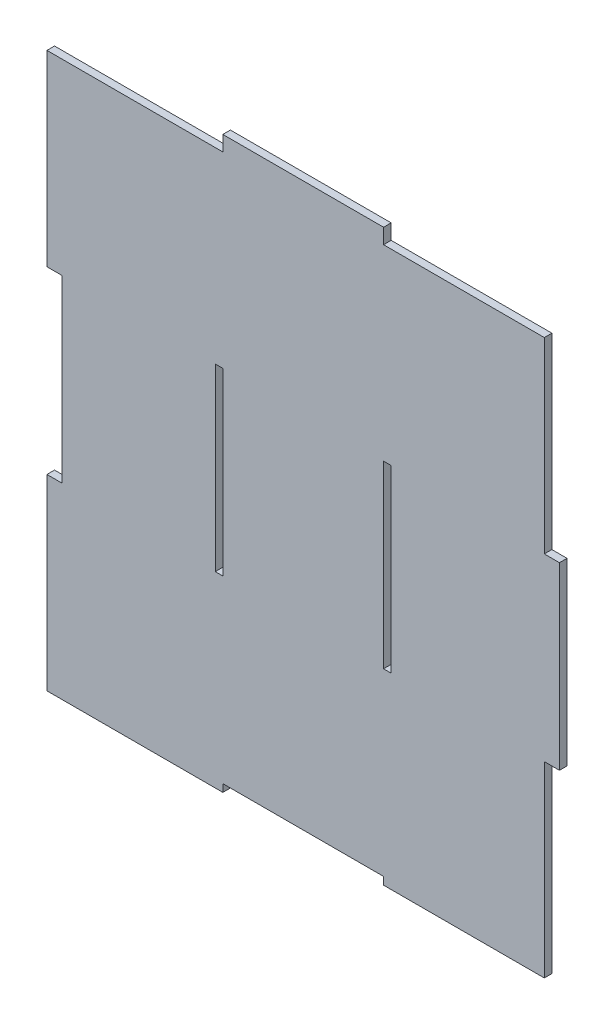
ISO-10303-21;
HEADER;
FILE_DESCRIPTION(('STEP AP214'),'2;1');
FILE_NAME('part.step','',(''),(''),'','','');
FILE_SCHEMA(('AUTOMOTIVE_DESIGN { 1 0 10303 214 1 1 1 1 }'));
ENDSEC;
DATA;
#1=APPLICATION_CONTEXT('core data for automotive mechanical design processes');
#2=APPLICATION_PROTOCOL_DEFINITION('international standard','automotive_design',2000,#1);
#3=PRODUCT_CONTEXT('',#1,'mechanical');
#4=PRODUCT('Part','Part','',(#3));
#5=PRODUCT_RELATED_PRODUCT_CATEGORY('part','',(#4));
#6=PRODUCT_DEFINITION_FORMATION('','',#4);
#7=PRODUCT_DEFINITION_CONTEXT('part definition',#1,'design');
#8=PRODUCT_DEFINITION('design','',#6,#7);
#9=PRODUCT_DEFINITION_SHAPE('','',#8);
#10=(LENGTH_UNIT() NAMED_UNIT(*) SI_UNIT(.MILLI.,.METRE.));
#11=(NAMED_UNIT(*) PLANE_ANGLE_UNIT() SI_UNIT($,.RADIAN.));
#12=(NAMED_UNIT(*) SI_UNIT($,.STERADIAN.) SOLID_ANGLE_UNIT());
#13=UNCERTAINTY_MEASURE_WITH_UNIT(LENGTH_MEASURE(1.E-05),#10,'distance_accuracy_value','');
#14=(GEOMETRIC_REPRESENTATION_CONTEXT(3) GLOBAL_UNCERTAINTY_ASSIGNED_CONTEXT((#13)) GLOBAL_UNIT_ASSIGNED_CONTEXT((#10,
#11,#12)) REPRESENTATION_CONTEXT('',''));
#15=CARTESIAN_POINT('',(0.,0.,0.));
#16=DIRECTION('',(0.,0.,1.));
#17=DIRECTION('',(1.,0.,0.));
#18=AXIS2_PLACEMENT_3D('',#15,#16,#17);
#19=CARTESIAN_POINT('',(0.,0.,0.));
#20=DIRECTION('',(0.,0.,1.));
#21=DIRECTION('',(1.,0.,0.));
#22=AXIS2_PLACEMENT_3D('',#19,#20,#21);
#23=PLANE('',#22);
#24=DIRECTION('',(1.,0.,0.));
#25=VECTOR('',#24,1.);
#26=CARTESIAN_POINT('',(-1.64639372418169E-13,-37.6666666666669,0.));
#27=LINE('',#26,#25);
#28=CARTESIAN_POINT('',(-48.8416666666666,-37.6666666666667,0.));
#29=VERTEX_POINT('',#28);
#30=CARTESIAN_POINT('',(-45.6666666666667,-37.6666666666667,0.));
#31=VERTEX_POINT('',#30);
#32=EDGE_CURVE('E446',#29,#31,#27,.T.);
#33=ORIENTED_EDGE('',*,*,#32,.T.);
#34=DIRECTION('',(0.,-1.,0.));
#35=VECTOR('',#34,1.);
#36=CARTESIAN_POINT('',(-45.6666666666667,0.,0.));
#37=LINE('',#36,#35);
#38=CARTESIAN_POINT('',(-45.6666666666667,37.6666666666667,0.));
#39=VERTEX_POINT('',#38);
#40=EDGE_CURVE('E349',#39,#31,#37,.T.);
#41=ORIENTED_EDGE('',*,*,#40,.F.);
#42=DIRECTION('',(1.,0.,0.));
#43=VECTOR('',#42,1.);
#44=CARTESIAN_POINT('',(-1.64639372418169E-13,37.6666666666669,0.));
#45=LINE('',#44,#43);
#46=CARTESIAN_POINT('',(-48.8416666666667,37.6666666666667,0.));
#47=VERTEX_POINT('',#46);
#48=EDGE_CURVE('E450',#47,#39,#45,.T.);
#49=ORIENTED_EDGE('',*,*,#48,.F.);
#50=DIRECTION('',(0.,1.,0.));
#51=VECTOR('',#50,1.);
#52=CARTESIAN_POINT('',(-48.8416666666667,0.,0.));
#53=LINE('',#52,#51);
#54=EDGE_CURVE('E283',#29,#47,#53,.T.);
#55=ORIENTED_EDGE('',*,*,#54,.F.);
#56=EDGE_LOOP('',(#33,#41,#49,#55));
#57=FACE_BOUND('',#56,.T.);
#58=DIRECTION('',(0.,1.,0.));
#59=VECTOR('',#58,1.);
#60=CARTESIAN_POINT('',(24.8416666666666,0.,0.));
#61=LINE('',#60,#59);
#62=CARTESIAN_POINT('',(24.8416666666666,-37.6666666666667,0.));
#63=VERTEX_POINT('',#62);
#64=CARTESIAN_POINT('',(24.8416666666666,37.6666666666667,0.));
#65=VERTEX_POINT('',#64);
#66=EDGE_CURVE('E434',#63,#65,#61,.T.);
#67=ORIENTED_EDGE('',*,*,#66,.T.);
#68=DIRECTION('',(-1.,0.,0.));
#69=VECTOR('',#68,1.);
#70=CARTESIAN_POINT('',(1.64639372418169E-13,37.6666666666668,0.));
#71=LINE('',#70,#69);
#72=CARTESIAN_POINT('',(21.6666666666667,37.6666666666667,0.));
#73=VERTEX_POINT('',#72);
#74=EDGE_CURVE('E443',#65,#73,#71,.T.);
#75=ORIENTED_EDGE('',*,*,#74,.T.);
#76=DIRECTION('',(0.,-1.,0.));
#77=VECTOR('',#76,1.);
#78=CARTESIAN_POINT('',(21.6666666666667,0.,0.));
#79=LINE('',#78,#77);
#80=CARTESIAN_POINT('',(21.6666666666667,-37.6666666666667,0.));
#81=VERTEX_POINT('',#80);
#82=EDGE_CURVE('E440',#73,#81,#79,.T.);
#83=ORIENTED_EDGE('',*,*,#82,.T.);
#84=DIRECTION('',(-1.,0.,0.));
#85=VECTOR('',#84,1.);
#86=CARTESIAN_POINT('',(1.64639372418169E-13,-37.6666666666668,0.));
#87=LINE('',#86,#85);
#88=EDGE_CURVE('E437',#63,#81,#87,.T.);
#89=ORIENTED_EDGE('',*,*,#88,.F.);
#90=EDGE_LOOP('',(#67,#75,#83,#89));
#91=FACE_BOUND('',#90,.T.);
#92=DIRECTION('',(1.,0.,0.));
#93=VECTOR('',#92,1.);
#94=CARTESIAN_POINT('',(-1.64639372418165E-13,-37.6666666666663,0.));
#95=LINE('',#94,#93);
#96=CARTESIAN_POINT('',(88.9999999999999,-37.6666666666667,0.));
#97=VERTEX_POINT('',#96);
#98=CARTESIAN_POINT('',(95.35,-37.6666666666667,0.));
#99=VERTEX_POINT('',#98);
#100=EDGE_CURVE('E318',#97,#99,#95,.T.);
#101=ORIENTED_EDGE('',*,*,#100,.F.);
#102=DIRECTION('',(0.,-1.,0.));
#103=VECTOR('',#102,1.);
#104=CARTESIAN_POINT('',(88.9999999999999,0.,0.));
#105=LINE('',#104,#103);
#106=CARTESIAN_POINT('',(89.,-116.175,0.));
#107=VERTEX_POINT('',#106);
#108=EDGE_CURVE('E644',#97,#107,#105,.T.);
#109=ORIENTED_EDGE('',*,*,#108,.T.);
#110=DIRECTION('',(1.,0.,0.));
#111=VECTOR('',#110,1.);
#112=CARTESIAN_POINT('',(0.,-116.175,0.));
#113=LINE('',#112,#111);
#114=CARTESIAN_POINT('',(21.6666666666667,-116.175,0.));
#115=VERTEX_POINT('',#114);
#116=EDGE_CURVE('E431',#115,#107,#113,.T.);
#117=ORIENTED_EDGE('',*,*,#116,.F.);
#118=DIRECTION('',(0.,1.,0.));
#119=VECTOR('',#118,1.);
#120=CARTESIAN_POINT('',(21.6666666666666,0.,0.));
#121=LINE('',#120,#119);
#122=CARTESIAN_POINT('',(21.6666666666667,-113.,0.));
#123=VERTEX_POINT('',#122);
#124=EDGE_CURVE('E428',#115,#123,#121,.T.);
#125=ORIENTED_EDGE('',*,*,#124,.T.);
#126=DIRECTION('',(1.,0.,0.));
#127=VECTOR('',#126,1.);
#128=CARTESIAN_POINT('',(0.,-113.,0.));
#129=LINE('',#128,#127);
#130=CARTESIAN_POINT('',(-45.6666666666667,-113.,0.));
#131=VERTEX_POINT('',#130);
#132=EDGE_CURVE('E425',#131,#123,#129,.T.);
#133=ORIENTED_EDGE('',*,*,#132,.F.);
#134=DIRECTION('',(0.,1.,0.));
#135=VECTOR('',#134,1.);
#136=CARTESIAN_POINT('',(-45.6666666666665,0.,0.));
#137=LINE('',#136,#135);
#138=CARTESIAN_POINT('',(-45.6666666666667,-116.175,0.));
#139=VERTEX_POINT('',#138);
#140=EDGE_CURVE('E423',#139,#131,#137,.T.);
#141=ORIENTED_EDGE('',*,*,#140,.F.);
#142=DIRECTION('',(-1.,0.,0.));
#143=VECTOR('',#142,1.);
#144=CARTESIAN_POINT('',(0.,-116.175,0.));
#145=LINE('',#144,#143);
#146=CARTESIAN_POINT('',(-119.35,-116.175,0.));
#147=VERTEX_POINT('',#146);
#148=EDGE_CURVE('E420',#139,#147,#145,.T.);
#149=ORIENTED_EDGE('',*,*,#148,.T.);
#150=DIRECTION('',(0.,-1.,0.));
#151=VECTOR('',#150,1.);
#152=CARTESIAN_POINT('',(-119.35,0.,0.));
#153=LINE('',#152,#151);
#154=CARTESIAN_POINT('',(-119.35,-37.6666666666667,0.));
#155=VERTEX_POINT('',#154);
#156=EDGE_CURVE('E595',#155,#147,#153,.T.);
#157=ORIENTED_EDGE('',*,*,#156,.F.);
#158=DIRECTION('',(1.,0.,0.));
#159=VECTOR('',#158,1.);
#160=CARTESIAN_POINT('',(0.,-37.6666666666667,0.));
#161=LINE('',#160,#159);
#162=CARTESIAN_POINT('',(-113.,-37.6666666666667,0.));
#163=VERTEX_POINT('',#162);
#164=EDGE_CURVE('E417',#155,#163,#161,.T.);
#165=ORIENTED_EDGE('',*,*,#164,.T.);
#166=DIRECTION('',(0.,-1.,0.));
#167=VECTOR('',#166,1.);
#168=CARTESIAN_POINT('',(-113.,0.,0.));
#169=LINE('',#168,#167);
#170=CARTESIAN_POINT('',(-113.,37.6666666666667,0.));
#171=VERTEX_POINT('',#170);
#172=EDGE_CURVE('E414',#171,#163,#169,.T.);
#173=ORIENTED_EDGE('',*,*,#172,.F.);
#174=DIRECTION('',(-1.,0.,0.));
#175=VECTOR('',#174,1.);
#176=CARTESIAN_POINT('',(1.64639372418165E-13,37.6666666666662,0.));
#177=LINE('',#176,#175);
#178=CARTESIAN_POINT('',(-119.35,37.6666666666667,0.));
#179=VERTEX_POINT('',#178);
#180=EDGE_CURVE('E411',#171,#179,#177,.T.);
#181=ORIENTED_EDGE('',*,*,#180,.T.);
#182=DIRECTION('',(0.,-1.,0.));
#183=VECTOR('',#182,1.);
#184=CARTESIAN_POINT('',(-119.35,0.,0.));
#185=LINE('',#184,#183);
#186=CARTESIAN_POINT('',(-119.35,116.175,0.));
#187=VERTEX_POINT('',#186);
#188=EDGE_CURVE('E341',#187,#179,#185,.T.);
#189=ORIENTED_EDGE('',*,*,#188,.F.);
#190=DIRECTION('',(-1.,0.,0.));
#191=VECTOR('',#190,1.);
#192=CARTESIAN_POINT('',(0.,116.175,0.));
#193=LINE('',#192,#191);
#194=CARTESIAN_POINT('',(-45.6666666666667,116.175,0.));
#195=VERTEX_POINT('',#194);
#196=EDGE_CURVE('E408',#195,#187,#193,.T.);
#197=ORIENTED_EDGE('',*,*,#196,.F.);
#198=DIRECTION('',(0.,-1.,0.));
#199=VECTOR('',#198,1.);
#200=CARTESIAN_POINT('',(-45.6666666666667,119.35,0.));
#201=LINE('',#200,#199);
#202=CARTESIAN_POINT('',(-45.6666666666667,122.525,0.));
#203=VERTEX_POINT('',#202);
#204=EDGE_CURVE('E122',#203,#195,#201,.T.);
#205=ORIENTED_EDGE('',*,*,#204,.F.);
#206=DIRECTION('',(-1.,0.,0.));
#207=VECTOR('',#206,1.);
#208=CARTESIAN_POINT('',(0.,122.525,0.));
#209=LINE('',#208,#207);
#210=CARTESIAN_POINT('',(21.6666666666667,122.525,0.));
#211=VERTEX_POINT('',#210);
#212=EDGE_CURVE('E584',#211,#203,#209,.T.);
#213=ORIENTED_EDGE('',*,*,#212,.F.);
#214=DIRECTION('',(0.,-1.,0.));
#215=VECTOR('',#214,1.);
#216=CARTESIAN_POINT('',(21.6666666666665,0.,0.));
#217=LINE('',#216,#215);
#218=CARTESIAN_POINT('',(21.6666666666667,116.175,0.));
#219=VERTEX_POINT('',#218);
#220=EDGE_CURVE('E405',#211,#219,#217,.T.);
#221=ORIENTED_EDGE('',*,*,#220,.T.);
#222=DIRECTION('',(1.,0.,0.));
#223=VECTOR('',#222,1.);
#224=CARTESIAN_POINT('',(0.,116.175,0.));
#225=LINE('',#224,#223);
#226=CARTESIAN_POINT('',(88.9999999999999,116.175,0.));
#227=VERTEX_POINT('',#226);
#228=EDGE_CURVE('E402',#219,#227,#225,.T.);
#229=ORIENTED_EDGE('',*,*,#228,.T.);
#230=DIRECTION('',(0.,1.,0.));
#231=VECTOR('',#230,1.);
#232=CARTESIAN_POINT('',(89.,0.,0.));
#233=LINE('',#232,#231);
#234=CARTESIAN_POINT('',(88.9999999999999,37.6666666666667,0.));
#235=VERTEX_POINT('',#234);
#236=EDGE_CURVE('E135',#235,#227,#233,.T.);
#237=ORIENTED_EDGE('',*,*,#236,.F.);
#238=DIRECTION('',(1.,0.,0.));
#239=VECTOR('',#238,1.);
#240=CARTESIAN_POINT('',(-1.64639372418165E-13,37.6666666666663,0.));
#241=LINE('',#240,#239);
#242=CARTESIAN_POINT('',(95.3499999999999,37.6666666666667,0.));
#243=VERTEX_POINT('',#242);
#244=EDGE_CURVE('E399',#235,#243,#241,.T.);
#245=ORIENTED_EDGE('',*,*,#244,.T.);
#246=DIRECTION('',(0.,-1.,0.));
#247=VECTOR('',#246,1.);
#248=CARTESIAN_POINT('',(95.3499999999999,0.,0.));
#249=LINE('',#248,#247);
#250=EDGE_CURVE('E324',#243,#99,#249,.T.);
#251=ORIENTED_EDGE('',*,*,#250,.T.);
#252=EDGE_LOOP('',(#101,#109,#117,#125,#133,#141,#149,#157,#165,#173,#181,#189,#197,#205,#213,
#221,#229,#237,#245,#251));
#253=FACE_BOUND('',#252,.T.);
#254=ADVANCED_FACE('F118',(#57,#91,#253),#23,.F.);
#255=CARTESIAN_POINT('',(0.,0.,3.175));
#256=DIRECTION('',(0.,0.,1.));
#257=DIRECTION('',(1.,0.,0.));
#258=AXIS2_PLACEMENT_3D('',#255,#256,#257);
#259=PLANE('',#258);
#260=DIRECTION('',(1.,0.,0.));
#261=VECTOR('',#260,1.);
#262=CARTESIAN_POINT('',(-1.64639372418169E-13,-37.6666666666669,3.175));
#263=LINE('',#262,#261);
#264=CARTESIAN_POINT('',(-48.8416666666666,-37.6666666666667,3.175));
#265=VERTEX_POINT('',#264);
#266=CARTESIAN_POINT('',(-45.6666666666667,-37.6666666666667,3.175));
#267=VERTEX_POINT('',#266);
#268=EDGE_CURVE('E278',#265,#267,#263,.T.);
#269=ORIENTED_EDGE('',*,*,#268,.F.);
#270=DIRECTION('',(0.,1.,0.));
#271=VECTOR('',#270,1.);
#272=CARTESIAN_POINT('',(-48.8416666666667,0.,3.175));
#273=LINE('',#272,#271);
#274=CARTESIAN_POINT('',(-48.8416666666667,37.6666666666667,3.175));
#275=VERTEX_POINT('',#274);
#276=EDGE_CURVE('E273',#265,#275,#273,.T.);
#277=ORIENTED_EDGE('',*,*,#276,.T.);
#278=DIRECTION('',(1.,0.,0.));
#279=VECTOR('',#278,1.);
#280=CARTESIAN_POINT('',(-1.64639372418169E-13,37.6666666666669,3.175));
#281=LINE('',#280,#279);
#282=CARTESIAN_POINT('',(-45.6666666666667,37.6666666666667,3.175));
#283=VERTEX_POINT('',#282);
#284=EDGE_CURVE('E265',#275,#283,#281,.T.);
#285=ORIENTED_EDGE('',*,*,#284,.T.);
#286=DIRECTION('',(0.,-1.,0.));
#287=VECTOR('',#286,1.);
#288=CARTESIAN_POINT('',(-45.6666666666667,0.,3.175));
#289=LINE('',#288,#287);
#290=EDGE_CURVE('E144',#283,#267,#289,.T.);
#291=ORIENTED_EDGE('',*,*,#290,.T.);
#292=EDGE_LOOP('',(#269,#277,#285,#291));
#293=FACE_BOUND('',#292,.T.);
#294=DIRECTION('',(0.,1.,0.));
#295=VECTOR('',#294,1.);
#296=CARTESIAN_POINT('',(24.8416666666666,0.,3.175));
#297=LINE('',#296,#295);
#298=CARTESIAN_POINT('',(24.8416666666666,-37.6666666666667,3.175));
#299=VERTEX_POINT('',#298);
#300=CARTESIAN_POINT('',(24.8416666666666,37.6666666666667,3.175));
#301=VERTEX_POINT('',#300);
#302=EDGE_CURVE('E384',#299,#301,#297,.T.);
#303=ORIENTED_EDGE('',*,*,#302,.F.);
#304=DIRECTION('',(-1.,0.,0.));
#305=VECTOR('',#304,1.);
#306=CARTESIAN_POINT('',(1.64639372418169E-13,-37.6666666666668,3.175));
#307=LINE('',#306,#305);
#308=CARTESIAN_POINT('',(21.6666666666667,-37.6666666666667,3.175));
#309=VERTEX_POINT('',#308);
#310=EDGE_CURVE('E387',#299,#309,#307,.T.);
#311=ORIENTED_EDGE('',*,*,#310,.T.);
#312=DIRECTION('',(0.,-1.,0.));
#313=VECTOR('',#312,1.);
#314=CARTESIAN_POINT('',(21.6666666666667,0.,3.175));
#315=LINE('',#314,#313);
#316=CARTESIAN_POINT('',(21.6666666666667,37.6666666666667,3.175));
#317=VERTEX_POINT('',#316);
#318=EDGE_CURVE('E389',#317,#309,#315,.T.);
#319=ORIENTED_EDGE('',*,*,#318,.F.);
#320=DIRECTION('',(-1.,0.,0.));
#321=VECTOR('',#320,1.);
#322=CARTESIAN_POINT('',(1.64639372418169E-13,37.6666666666668,3.175));
#323=LINE('',#322,#321);
#324=EDGE_CURVE('E392',#301,#317,#323,.T.);
#325=ORIENTED_EDGE('',*,*,#324,.F.);
#326=EDGE_LOOP('',(#303,#311,#319,#325));
#327=FACE_BOUND('',#326,.T.);
#328=DIRECTION('',(0.,-1.,0.));
#329=VECTOR('',#328,1.);
#330=CARTESIAN_POINT('',(88.9999999999999,0.,3.175));
#331=LINE('',#330,#329);
#332=CARTESIAN_POINT('',(88.9999999999999,-37.6666666666667,3.175));
#333=VERTEX_POINT('',#332);
#334=CARTESIAN_POINT('',(89.,-116.175,3.175));
#335=VERTEX_POINT('',#334);
#336=EDGE_CURVE('E645',#333,#335,#331,.T.);
#337=ORIENTED_EDGE('',*,*,#336,.F.);
#338=DIRECTION('',(1.,0.,0.));
#339=VECTOR('',#338,1.);
#340=CARTESIAN_POINT('',(-1.64639372418165E-13,-37.6666666666663,3.175));
#341=LINE('',#340,#339);
#342=CARTESIAN_POINT('',(95.35,-37.6666666666667,3.175));
#343=VERTEX_POINT('',#342);
#344=EDGE_CURVE('E215',#333,#343,#341,.T.);
#345=ORIENTED_EDGE('',*,*,#344,.T.);
#346=DIRECTION('',(0.,-1.,0.));
#347=VECTOR('',#346,1.);
#348=CARTESIAN_POINT('',(95.3499999999999,0.,3.175));
#349=LINE('',#348,#347);
#350=CARTESIAN_POINT('',(95.3499999999999,37.6666666666667,3.175));
#351=VERTEX_POINT('',#350);
#352=EDGE_CURVE('E348',#351,#343,#349,.T.);
#353=ORIENTED_EDGE('',*,*,#352,.F.);
#354=DIRECTION('',(1.,0.,0.));
#355=VECTOR('',#354,1.);
#356=CARTESIAN_POINT('',(-1.64639372418165E-13,37.6666666666663,3.175));
#357=LINE('',#356,#355);
#358=CARTESIAN_POINT('',(88.9999999999999,37.6666666666667,3.175));
#359=VERTEX_POINT('',#358);
#360=EDGE_CURVE('E352',#359,#351,#357,.T.);
#361=ORIENTED_EDGE('',*,*,#360,.F.);
#362=DIRECTION('',(0.,1.,0.));
#363=VECTOR('',#362,1.);
#364=CARTESIAN_POINT('',(89.,0.,3.175));
#365=LINE('',#364,#363);
#366=CARTESIAN_POINT('',(88.9999999999999,116.175,3.175));
#367=VERTEX_POINT('',#366);
#368=EDGE_CURVE('E572',#359,#367,#365,.T.);
#369=ORIENTED_EDGE('',*,*,#368,.T.);
#370=DIRECTION('',(1.,0.,0.));
#371=VECTOR('',#370,1.);
#372=CARTESIAN_POINT('',(0.,116.175,3.175));
#373=LINE('',#372,#371);
#374=CARTESIAN_POINT('',(21.6666666666667,116.175,3.175));
#375=VERTEX_POINT('',#374);
#376=EDGE_CURVE('E355',#375,#367,#373,.T.);
#377=ORIENTED_EDGE('',*,*,#376,.F.);
#378=DIRECTION('',(0.,-1.,0.));
#379=VECTOR('',#378,1.);
#380=CARTESIAN_POINT('',(21.6666666666665,0.,3.175));
#381=LINE('',#380,#379);
#382=CARTESIAN_POINT('',(21.6666666666667,122.525,3.175));
#383=VERTEX_POINT('',#382);
#384=EDGE_CURVE('E358',#383,#375,#381,.T.);
#385=ORIENTED_EDGE('',*,*,#384,.F.);
#386=DIRECTION('',(-1.,0.,0.));
#387=VECTOR('',#386,1.);
#388=CARTESIAN_POINT('',(0.,122.525,3.175));
#389=LINE('',#388,#387);
#390=CARTESIAN_POINT('',(-45.6666666666667,122.525,3.175));
#391=VERTEX_POINT('',#390);
#392=EDGE_CURVE('E582',#383,#391,#389,.T.);
#393=ORIENTED_EDGE('',*,*,#392,.T.);
#394=DIRECTION('',(0.,-1.,0.));
#395=VECTOR('',#394,1.);
#396=CARTESIAN_POINT('',(-45.6666666666667,119.35,3.175));
#397=LINE('',#396,#395);
#398=CARTESIAN_POINT('',(-45.6666666666667,116.175,3.175));
#399=VERTEX_POINT('',#398);
#400=EDGE_CURVE('E316',#391,#399,#397,.T.);
#401=ORIENTED_EDGE('',*,*,#400,.T.);
#402=DIRECTION('',(-1.,0.,0.));
#403=VECTOR('',#402,1.);
#404=CARTESIAN_POINT('',(0.,116.175,3.175));
#405=LINE('',#404,#403);
#406=CARTESIAN_POINT('',(-119.35,116.175,3.175));
#407=VERTEX_POINT('',#406);
#408=EDGE_CURVE('E361',#399,#407,#405,.T.);
#409=ORIENTED_EDGE('',*,*,#408,.T.);
#410=DIRECTION('',(0.,-1.,0.));
#411=VECTOR('',#410,1.);
#412=CARTESIAN_POINT('',(-119.35,0.,3.175));
#413=LINE('',#412,#411);
#414=CARTESIAN_POINT('',(-119.35,37.6666666666667,3.175));
#415=VERTEX_POINT('',#414);
#416=EDGE_CURVE('E344',#407,#415,#413,.T.);
#417=ORIENTED_EDGE('',*,*,#416,.T.);
#418=DIRECTION('',(-1.,0.,0.));
#419=VECTOR('',#418,1.);
#420=CARTESIAN_POINT('',(1.64639372418165E-13,37.6666666666662,3.175));
#421=LINE('',#420,#419);
#422=CARTESIAN_POINT('',(-113.,37.6666666666667,3.175));
#423=VERTEX_POINT('',#422);
#424=EDGE_CURVE('E363',#423,#415,#421,.T.);
#425=ORIENTED_EDGE('',*,*,#424,.F.);
#426=DIRECTION('',(0.,-1.,0.));
#427=VECTOR('',#426,1.);
#428=CARTESIAN_POINT('',(-113.,0.,3.175));
#429=LINE('',#428,#427);
#430=CARTESIAN_POINT('',(-113.,-37.6666666666667,3.175));
#431=VERTEX_POINT('',#430);
#432=EDGE_CURVE('E366',#423,#431,#429,.T.);
#433=ORIENTED_EDGE('',*,*,#432,.T.);
#434=DIRECTION('',(1.,0.,0.));
#435=VECTOR('',#434,1.);
#436=CARTESIAN_POINT('',(0.,-37.6666666666667,3.175));
#437=LINE('',#436,#435);
#438=CARTESIAN_POINT('',(-119.35,-37.6666666666667,3.175));
#439=VERTEX_POINT('',#438);
#440=EDGE_CURVE('E368',#439,#431,#437,.T.);
#441=ORIENTED_EDGE('',*,*,#440,.F.);
#442=DIRECTION('',(0.,-1.,0.));
#443=VECTOR('',#442,1.);
#444=CARTESIAN_POINT('',(-119.35,0.,3.175));
#445=LINE('',#444,#443);
#446=CARTESIAN_POINT('',(-119.35,-116.175,3.175));
#447=VERTEX_POINT('',#446);
#448=EDGE_CURVE('E592',#439,#447,#445,.T.);
#449=ORIENTED_EDGE('',*,*,#448,.T.);
#450=DIRECTION('',(-1.,0.,0.));
#451=VECTOR('',#450,1.);
#452=CARTESIAN_POINT('',(0.,-116.175,3.175));
#453=LINE('',#452,#451);
#454=CARTESIAN_POINT('',(-45.6666666666667,-116.175,3.175));
#455=VERTEX_POINT('',#454);
#456=EDGE_CURVE('E371',#455,#447,#453,.T.);
#457=ORIENTED_EDGE('',*,*,#456,.F.);
#458=DIRECTION('',(0.,1.,0.));
#459=VECTOR('',#458,1.);
#460=CARTESIAN_POINT('',(-45.6666666666665,0.,3.175));
#461=LINE('',#460,#459);
#462=CARTESIAN_POINT('',(-45.6666666666667,-113.,3.175));
#463=VERTEX_POINT('',#462);
#464=EDGE_CURVE('E374',#455,#463,#461,.T.);
#465=ORIENTED_EDGE('',*,*,#464,.T.);
#466=DIRECTION('',(1.,0.,0.));
#467=VECTOR('',#466,1.);
#468=CARTESIAN_POINT('',(0.,-113.,3.175));
#469=LINE('',#468,#467);
#470=CARTESIAN_POINT('',(21.6666666666667,-113.,3.175));
#471=VERTEX_POINT('',#470);
#472=EDGE_CURVE('E376',#463,#471,#469,.T.);
#473=ORIENTED_EDGE('',*,*,#472,.T.);
#474=DIRECTION('',(0.,1.,0.));
#475=VECTOR('',#474,1.);
#476=CARTESIAN_POINT('',(21.6666666666666,0.,3.175));
#477=LINE('',#476,#475);
#478=CARTESIAN_POINT('',(21.6666666666667,-116.175,3.175));
#479=VERTEX_POINT('',#478);
#480=EDGE_CURVE('E378',#479,#471,#477,.T.);
#481=ORIENTED_EDGE('',*,*,#480,.F.);
#482=DIRECTION('',(1.,0.,0.));
#483=VECTOR('',#482,1.);
#484=CARTESIAN_POINT('',(0.,-116.175,3.175));
#485=LINE('',#484,#483);
#486=EDGE_CURVE('E381',#479,#335,#485,.T.);
#487=ORIENTED_EDGE('',*,*,#486,.T.);
#488=EDGE_LOOP('',(#337,#345,#353,#361,#369,#377,#385,#393,#401,#409,#417,#425,#433,#441,#449,
#457,#465,#473,#481,#487));
#489=FACE_BOUND('',#488,.T.);
#490=ADVANCED_FACE('F276',(#293,#327,#489),#259,.T.);
#491=CARTESIAN_POINT('',(0.,116.175,3.175));
#492=DIRECTION('',(0.,1.,0.));
#493=DIRECTION('',(-1.,0.,0.));
#494=AXIS2_PLACEMENT_3D('',#491,#492,#493);
#495=PLANE('',#494);
#496=ORIENTED_EDGE('',*,*,#376,.T.);
#497=DIRECTION('',(0.,0.,1.));
#498=VECTOR('',#497,1.);
#499=CARTESIAN_POINT('',(88.9999999999999,116.175,0.));
#500=LINE('',#499,#498);
#501=EDGE_CURVE('E570',#227,#367,#500,.T.);
#502=ORIENTED_EDGE('',*,*,#501,.F.);
#503=ORIENTED_EDGE('',*,*,#228,.F.);
#504=DIRECTION('',(0.,0.,-1.));
#505=VECTOR('',#504,1.);
#506=CARTESIAN_POINT('',(21.6666666666667,116.175,3.175));
#507=LINE('',#506,#505);
#508=EDGE_CURVE('E312',#375,#219,#507,.T.);
#509=ORIENTED_EDGE('',*,*,#508,.F.);
#510=EDGE_LOOP('',(#496,#502,#503,#509));
#511=FACE_BOUND('',#510,.T.);
#512=ADVANCED_FACE('F472',(#511),#495,.T.);
#513=CARTESIAN_POINT('',(21.6666666666665,0.,3.175));
#514=DIRECTION('',(1.,0.,0.));
#515=DIRECTION('',(0.,1.,0.));
#516=AXIS2_PLACEMENT_3D('',#513,#514,#515);
#517=PLANE('',#516);
#518=ORIENTED_EDGE('',*,*,#220,.F.);
#519=DIRECTION('',(0.,0.,1.));
#520=VECTOR('',#519,1.);
#521=CARTESIAN_POINT('',(21.6666666666667,122.525,0.));
#522=LINE('',#521,#520);
#523=EDGE_CURVE('E587',#211,#383,#522,.T.);
#524=ORIENTED_EDGE('',*,*,#523,.T.);
#525=ORIENTED_EDGE('',*,*,#384,.T.);
#526=ORIENTED_EDGE('',*,*,#508,.T.);
#527=EDGE_LOOP('',(#518,#524,#525,#526));
#528=FACE_BOUND('',#527,.T.);
#529=ADVANCED_FACE('F531',(#528),#517,.T.);
#530=CARTESIAN_POINT('',(0.,116.175,3.175));
#531=DIRECTION('',(0.,-1.,0.));
#532=DIRECTION('',(1.,0.,0.));
#533=AXIS2_PLACEMENT_3D('',#530,#531,#532);
#534=PLANE('',#533);
#535=ORIENTED_EDGE('',*,*,#196,.T.);
#536=DIRECTION('',(0.,0.,1.));
#537=VECTOR('',#536,1.);
#538=CARTESIAN_POINT('',(-119.35,116.175,0.));
#539=LINE('',#538,#537);
#540=EDGE_CURVE('E333',#187,#407,#539,.T.);
#541=ORIENTED_EDGE('',*,*,#540,.T.);
#542=ORIENTED_EDGE('',*,*,#408,.F.);
#543=DIRECTION('',(0.,0.,-1.));
#544=VECTOR('',#543,1.);
#545=CARTESIAN_POINT('',(-45.6666666666667,116.175,3.175));
#546=LINE('',#545,#544);
#547=EDGE_CURVE('E310',#399,#195,#546,.T.);
#548=ORIENTED_EDGE('',*,*,#547,.T.);
#549=EDGE_LOOP('',(#535,#541,#542,#548));
#550=FACE_BOUND('',#549,.T.);
#551=ADVANCED_FACE('F527',(#550),#534,.F.);
#552=CARTESIAN_POINT('',(1.64639372418165E-13,37.6666666666662,3.175));
#553=DIRECTION('',(0.,-1.,0.));
#554=DIRECTION('',(1.,0.,0.));
#555=AXIS2_PLACEMENT_3D('',#552,#553,#554);
#556=PLANE('',#555);
#557=ORIENTED_EDGE('',*,*,#180,.F.);
#558=DIRECTION('',(0.,0.,-1.));
#559=VECTOR('',#558,1.);
#560=CARTESIAN_POINT('',(-113.,37.6666666666667,3.175));
#561=LINE('',#560,#559);
#562=EDGE_CURVE('E308',#423,#171,#561,.T.);
#563=ORIENTED_EDGE('',*,*,#562,.F.);
#564=ORIENTED_EDGE('',*,*,#424,.T.);
#565=DIRECTION('',(0.,0.,1.));
#566=VECTOR('',#565,1.);
#567=CARTESIAN_POINT('',(-119.35,37.6666666666667,0.));
#568=LINE('',#567,#566);
#569=EDGE_CURVE('E327',#179,#415,#568,.T.);
#570=ORIENTED_EDGE('',*,*,#569,.F.);
#571=EDGE_LOOP('',(#557,#563,#564,#570));
#572=FACE_BOUND('',#571,.T.);
#573=ADVANCED_FACE('F523',(#572),#556,.T.);
#574=CARTESIAN_POINT('',(-113.,0.,3.175));
#575=DIRECTION('',(1.,0.,0.));
#576=DIRECTION('',(0.,1.,0.));
#577=AXIS2_PLACEMENT_3D('',#574,#575,#576);
#578=PLANE('',#577);
#579=ORIENTED_EDGE('',*,*,#172,.T.);
#580=DIRECTION('',(0.,0.,-1.));
#581=VECTOR('',#580,1.);
#582=CARTESIAN_POINT('',(-113.,-37.6666666666667,3.175));
#583=LINE('',#582,#581);
#584=EDGE_CURVE('E306',#431,#163,#583,.T.);
#585=ORIENTED_EDGE('',*,*,#584,.F.);
#586=ORIENTED_EDGE('',*,*,#432,.F.);
#587=ORIENTED_EDGE('',*,*,#562,.T.);
#588=EDGE_LOOP('',(#579,#585,#586,#587));
#589=FACE_BOUND('',#588,.T.);
#590=ADVANCED_FACE('F519',(#589),#578,.F.);
#591=CARTESIAN_POINT('',(0.,-37.6666666666667,3.175));
#592=DIRECTION('',(0.,1.,0.));
#593=DIRECTION('',(0.,0.,1.));
#594=AXIS2_PLACEMENT_3D('',#591,#592,#593);
#595=PLANE('',#594);
#596=ORIENTED_EDGE('',*,*,#164,.F.);
#597=DIRECTION('',(0.,0.,1.));
#598=VECTOR('',#597,1.);
#599=CARTESIAN_POINT('',(-119.35,-37.6666666666667,0.));
#600=LINE('',#599,#598);
#601=EDGE_CURVE('E598',#155,#439,#600,.T.);
#602=ORIENTED_EDGE('',*,*,#601,.T.);
#603=ORIENTED_EDGE('',*,*,#440,.T.);
#604=ORIENTED_EDGE('',*,*,#584,.T.);
#605=EDGE_LOOP('',(#596,#602,#603,#604));
#606=FACE_BOUND('',#605,.T.);
#607=ADVANCED_FACE('F515',(#606),#595,.T.);
#608=CARTESIAN_POINT('',(0.,-116.175,3.175));
#609=DIRECTION('',(0.,-1.,0.));
#610=DIRECTION('',(1.,0.,0.));
#611=AXIS2_PLACEMENT_3D('',#608,#609,#610);
#612=PLANE('',#611);
#613=ORIENTED_EDGE('',*,*,#148,.F.);
#614=DIRECTION('',(0.,0.,-1.));
#615=VECTOR('',#614,1.);
#616=CARTESIAN_POINT('',(-45.6666666666667,-116.175,3.175));
#617=LINE('',#616,#615);
#618=EDGE_CURVE('E304',#455,#139,#617,.T.);
#619=ORIENTED_EDGE('',*,*,#618,.F.);
#620=ORIENTED_EDGE('',*,*,#456,.T.);
#621=DIRECTION('',(0.,0.,1.));
#622=VECTOR('',#621,1.);
#623=CARTESIAN_POINT('',(-119.35,-116.175,0.));
#624=LINE('',#623,#622);
#625=EDGE_CURVE('E601',#147,#447,#624,.T.);
#626=ORIENTED_EDGE('',*,*,#625,.F.);
#627=EDGE_LOOP('',(#613,#619,#620,#626));
#628=FACE_BOUND('',#627,.T.);
#629=ADVANCED_FACE('F511',(#628),#612,.T.);
#630=CARTESIAN_POINT('',(-45.6666666666665,0.,3.175));
#631=DIRECTION('',(-1.,0.,0.));
#632=DIRECTION('',(0.,-1.,0.));
#633=AXIS2_PLACEMENT_3D('',#630,#631,#632);
#634=PLANE('',#633);
#635=ORIENTED_EDGE('',*,*,#140,.T.);
#636=DIRECTION('',(0.,0.,-1.));
#637=VECTOR('',#636,1.);
#638=CARTESIAN_POINT('',(-45.6666666666667,-113.,3.175));
#639=LINE('',#638,#637);
#640=EDGE_CURVE('E301',#463,#131,#639,.T.);
#641=ORIENTED_EDGE('',*,*,#640,.F.);
#642=ORIENTED_EDGE('',*,*,#464,.F.);
#643=ORIENTED_EDGE('',*,*,#618,.T.);
#644=EDGE_LOOP('',(#635,#641,#642,#643));
#645=FACE_BOUND('',#644,.T.);
#646=ADVANCED_FACE('F507',(#645),#634,.F.);
#647=CARTESIAN_POINT('',(0.,-113.,3.175));
#648=DIRECTION('',(0.,1.,0.));
#649=DIRECTION('',(-1.,0.,0.));
#650=AXIS2_PLACEMENT_3D('',#647,#648,#649);
#651=PLANE('',#650);
#652=ORIENTED_EDGE('',*,*,#132,.T.);
#653=DIRECTION('',(0.,0.,-1.));
#654=VECTOR('',#653,1.);
#655=CARTESIAN_POINT('',(21.6666666666667,-113.,3.175));
#656=LINE('',#655,#654);
#657=EDGE_CURVE('E299',#471,#123,#656,.T.);
#658=ORIENTED_EDGE('',*,*,#657,.F.);
#659=ORIENTED_EDGE('',*,*,#472,.F.);
#660=ORIENTED_EDGE('',*,*,#640,.T.);
#661=EDGE_LOOP('',(#652,#658,#659,#660));
#662=FACE_BOUND('',#661,.T.);
#663=ADVANCED_FACE('F503',(#662),#651,.F.);
#664=CARTESIAN_POINT('',(21.6666666666666,0.,3.175));
#665=DIRECTION('',(-1.,0.,0.));
#666=DIRECTION('',(0.,-1.,0.));
#667=AXIS2_PLACEMENT_3D('',#664,#665,#666);
#668=PLANE('',#667);
#669=ORIENTED_EDGE('',*,*,#124,.F.);
#670=DIRECTION('',(0.,0.,-1.));
#671=VECTOR('',#670,1.);
#672=CARTESIAN_POINT('',(21.6666666666667,-116.175,3.175));
#673=LINE('',#672,#671);
#674=EDGE_CURVE('E297',#479,#115,#673,.T.);
#675=ORIENTED_EDGE('',*,*,#674,.F.);
#676=ORIENTED_EDGE('',*,*,#480,.T.);
#677=ORIENTED_EDGE('',*,*,#657,.T.);
#678=EDGE_LOOP('',(#669,#675,#676,#677));
#679=FACE_BOUND('',#678,.T.);
#680=ADVANCED_FACE('F499',(#679),#668,.T.);
#681=CARTESIAN_POINT('',(0.,-116.175,3.175));
#682=DIRECTION('',(0.,1.,0.));
#683=DIRECTION('',(-1.,0.,0.));
#684=AXIS2_PLACEMENT_3D('',#681,#682,#683);
#685=PLANE('',#684);
#686=ORIENTED_EDGE('',*,*,#116,.T.);
#687=DIRECTION('',(0.,0.,1.));
#688=VECTOR('',#687,1.);
#689=CARTESIAN_POINT('',(89.,-116.175,0.));
#690=LINE('',#689,#688);
#691=EDGE_CURVE('E575',#107,#335,#690,.T.);
#692=ORIENTED_EDGE('',*,*,#691,.T.);
#693=ORIENTED_EDGE('',*,*,#486,.F.);
#694=ORIENTED_EDGE('',*,*,#674,.T.);
#695=EDGE_LOOP('',(#686,#692,#693,#694));
#696=FACE_BOUND('',#695,.T.);
#697=ADVANCED_FACE('F495',(#696),#685,.F.);
#698=CARTESIAN_POINT('',(-1.64639372418165E-13,-37.6666666666663,3.175));
#699=DIRECTION('',(0.,1.,0.));
#700=DIRECTION('',(-1.,0.,0.));
#701=AXIS2_PLACEMENT_3D('',#698,#699,#700);
#702=PLANE('',#701);
#703=ORIENTED_EDGE('',*,*,#100,.T.);
#704=DIRECTION('',(0.,0.,-1.));
#705=VECTOR('',#704,1.);
#706=CARTESIAN_POINT('',(95.35,-37.6666666666667,3.175));
#707=LINE('',#706,#705);
#708=EDGE_CURVE('E291',#343,#99,#707,.T.);
#709=ORIENTED_EDGE('',*,*,#708,.F.);
#710=ORIENTED_EDGE('',*,*,#344,.F.);
#711=DIRECTION('',(0.,0.,1.));
#712=VECTOR('',#711,1.);
#713=CARTESIAN_POINT('',(88.9999999999999,-37.6666666666667,0.));
#714=LINE('',#713,#712);
#715=EDGE_CURVE('E554',#97,#333,#714,.T.);
#716=ORIENTED_EDGE('',*,*,#715,.F.);
#717=EDGE_LOOP('',(#703,#709,#710,#716));
#718=FACE_BOUND('',#717,.T.);
#719=ADVANCED_FACE('F498',(#718),#702,.F.);
#720=CARTESIAN_POINT('',(95.3499999999999,0.,3.175));
#721=DIRECTION('',(1.,0.,0.));
#722=DIRECTION('',(0.,1.,0.));
#723=AXIS2_PLACEMENT_3D('',#720,#721,#722);
#724=PLANE('',#723);
#725=ORIENTED_EDGE('',*,*,#250,.F.);
#726=DIRECTION('',(0.,0.,-1.));
#727=VECTOR('',#726,1.);
#728=CARTESIAN_POINT('',(95.3499999999999,37.6666666666667,3.175));
#729=LINE('',#728,#727);
#730=EDGE_CURVE('E314',#351,#243,#729,.T.);
#731=ORIENTED_EDGE('',*,*,#730,.F.);
#732=ORIENTED_EDGE('',*,*,#352,.T.);
#733=ORIENTED_EDGE('',*,*,#708,.T.);
#734=EDGE_LOOP('',(#725,#731,#732,#733));
#735=FACE_BOUND('',#734,.T.);
#736=ADVANCED_FACE('F542',(#735),#724,.T.);
#737=CARTESIAN_POINT('',(-1.64639372418165E-13,37.6666666666663,3.175));
#738=DIRECTION('',(0.,1.,0.));
#739=DIRECTION('',(-1.,0.,0.));
#740=AXIS2_PLACEMENT_3D('',#737,#738,#739);
#741=PLANE('',#740);
#742=ORIENTED_EDGE('',*,*,#244,.F.);
#743=DIRECTION('',(0.,0.,1.));
#744=VECTOR('',#743,1.);
#745=CARTESIAN_POINT('',(88.9999999999999,37.6666666666667,0.));
#746=LINE('',#745,#744);
#747=EDGE_CURVE('E564',#235,#359,#746,.T.);
#748=ORIENTED_EDGE('',*,*,#747,.T.);
#749=ORIENTED_EDGE('',*,*,#360,.T.);
#750=ORIENTED_EDGE('',*,*,#730,.T.);
#751=EDGE_LOOP('',(#742,#748,#749,#750));
#752=FACE_BOUND('',#751,.T.);
#753=ADVANCED_FACE('F539',(#752),#741,.T.);
#754=CARTESIAN_POINT('',(1.64639372418169E-13,-37.6666666666668,3.175));
#755=DIRECTION('',(0.,-1.,0.));
#756=DIRECTION('',(1.,0.,0.));
#757=AXIS2_PLACEMENT_3D('',#754,#755,#756);
#758=PLANE('',#757);
#759=ORIENTED_EDGE('',*,*,#88,.T.);
#760=DIRECTION('',(0.,0.,-1.));
#761=VECTOR('',#760,1.);
#762=CARTESIAN_POINT('',(21.6666666666667,-37.6666666666667,3.175));
#763=LINE('',#762,#761);
#764=EDGE_CURVE('E293',#309,#81,#763,.T.);
#765=ORIENTED_EDGE('',*,*,#764,.F.);
#766=ORIENTED_EDGE('',*,*,#310,.F.);
#767=DIRECTION('',(0.,0.,-1.));
#768=VECTOR('',#767,1.);
#769=CARTESIAN_POINT('',(24.8416666666666,-37.6666666666667,3.175));
#770=LINE('',#769,#768);
#771=EDGE_CURVE('E295',#299,#63,#770,.T.);
#772=ORIENTED_EDGE('',*,*,#771,.T.);
#773=EDGE_LOOP('',(#759,#765,#766,#772));
#774=FACE_BOUND('',#773,.T.);
#775=ADVANCED_FACE('F493',(#774),#758,.F.);
#776=CARTESIAN_POINT('',(21.6666666666667,0.,3.175));
#777=DIRECTION('',(1.,0.,0.));
#778=DIRECTION('',(0.,1.,0.));
#779=AXIS2_PLACEMENT_3D('',#776,#777,#778);
#780=PLANE('',#779);
#781=ORIENTED_EDGE('',*,*,#82,.F.);
#782=DIRECTION('',(0.,0.,-1.));
#783=VECTOR('',#782,1.);
#784=CARTESIAN_POINT('',(21.6666666666667,37.6666666666667,3.175));
#785=LINE('',#784,#783);
#786=EDGE_CURVE('E290',#317,#73,#785,.T.);
#787=ORIENTED_EDGE('',*,*,#786,.F.);
#788=ORIENTED_EDGE('',*,*,#318,.T.);
#789=ORIENTED_EDGE('',*,*,#764,.T.);
#790=EDGE_LOOP('',(#781,#787,#788,#789));
#791=FACE_BOUND('',#790,.T.);
#792=ADVANCED_FACE('F488',(#791),#780,.T.);
#793=CARTESIAN_POINT('',(1.64639372418169E-13,37.6666666666668,3.175));
#794=DIRECTION('',(0.,-1.,0.));
#795=DIRECTION('',(1.,0.,0.));
#796=AXIS2_PLACEMENT_3D('',#793,#794,#795);
#797=PLANE('',#796);
#798=ORIENTED_EDGE('',*,*,#74,.F.);
#799=DIRECTION('',(0.,0.,-1.));
#800=VECTOR('',#799,1.);
#801=CARTESIAN_POINT('',(24.8416666666666,37.6666666666667,3.175));
#802=LINE('',#801,#800);
#803=EDGE_CURVE('E288',#301,#65,#802,.T.);
#804=ORIENTED_EDGE('',*,*,#803,.F.);
#805=ORIENTED_EDGE('',*,*,#324,.T.);
#806=ORIENTED_EDGE('',*,*,#786,.T.);
#807=EDGE_LOOP('',(#798,#804,#805,#806));
#808=FACE_BOUND('',#807,.T.);
#809=ADVANCED_FACE('F482',(#808),#797,.T.);
#810=CARTESIAN_POINT('',(24.8416666666666,0.,3.175));
#811=DIRECTION('',(-1.,0.,0.));
#812=DIRECTION('',(0.,-1.,0.));
#813=AXIS2_PLACEMENT_3D('',#810,#811,#812);
#814=PLANE('',#813);
#815=ORIENTED_EDGE('',*,*,#66,.F.);
#816=ORIENTED_EDGE('',*,*,#771,.F.);
#817=ORIENTED_EDGE('',*,*,#302,.T.);
#818=ORIENTED_EDGE('',*,*,#803,.T.);
#819=EDGE_LOOP('',(#815,#816,#817,#818));
#820=FACE_BOUND('',#819,.T.);
#821=ADVANCED_FACE('F478',(#820),#814,.T.);
#822=CARTESIAN_POINT('',(-48.8416666666667,0.,3.175));
#823=DIRECTION('',(-1.,0.,0.));
#824=DIRECTION('',(0.,-1.,0.));
#825=AXIS2_PLACEMENT_3D('',#822,#823,#824);
#826=PLANE('',#825);
#827=ORIENTED_EDGE('',*,*,#54,.T.);
#828=DIRECTION('',(0.,0.,-1.));
#829=VECTOR('',#828,1.);
#830=CARTESIAN_POINT('',(-48.8416666666667,37.6666666666667,3.175));
#831=LINE('',#830,#829);
#832=EDGE_CURVE('E127',#275,#47,#831,.T.);
#833=ORIENTED_EDGE('',*,*,#832,.F.);
#834=ORIENTED_EDGE('',*,*,#276,.F.);
#835=DIRECTION('',(0.,0.,-1.));
#836=VECTOR('',#835,1.);
#837=CARTESIAN_POINT('',(-48.8416666666666,-37.6666666666667,3.175));
#838=LINE('',#837,#836);
#839=EDGE_CURVE('E12',#265,#29,#838,.T.);
#840=ORIENTED_EDGE('',*,*,#839,.T.);
#841=EDGE_LOOP('',(#827,#833,#834,#840));
#842=FACE_BOUND('',#841,.T.);
#843=ADVANCED_FACE('F281',(#842),#826,.F.);
#844=CARTESIAN_POINT('',(-1.64639372418169E-13,37.6666666666669,3.175));
#845=DIRECTION('',(0.,1.,0.));
#846=DIRECTION('',(-1.,0.,0.));
#847=AXIS2_PLACEMENT_3D('',#844,#845,#846);
#848=PLANE('',#847);
#849=ORIENTED_EDGE('',*,*,#48,.T.);
#850=DIRECTION('',(0.,0.,-1.));
#851=VECTOR('',#850,1.);
#852=CARTESIAN_POINT('',(-45.6666666666667,37.6666666666667,3.175));
#853=LINE('',#852,#851);
#854=EDGE_CURVE('E272',#283,#39,#853,.T.);
#855=ORIENTED_EDGE('',*,*,#854,.F.);
#856=ORIENTED_EDGE('',*,*,#284,.F.);
#857=ORIENTED_EDGE('',*,*,#832,.T.);
#858=EDGE_LOOP('',(#849,#855,#856,#857));
#859=FACE_BOUND('',#858,.T.);
#860=ADVANCED_FACE('F268',(#859),#848,.F.);
#861=CARTESIAN_POINT('',(-45.6666666666667,0.,3.175));
#862=DIRECTION('',(1.,0.,0.));
#863=DIRECTION('',(0.,1.,0.));
#864=AXIS2_PLACEMENT_3D('',#861,#862,#863);
#865=PLANE('',#864);
#866=ORIENTED_EDGE('',*,*,#40,.T.);
#867=DIRECTION('',(0.,0.,-1.));
#868=VECTOR('',#867,1.);
#869=CARTESIAN_POINT('',(-45.6666666666667,-37.6666666666667,3.175));
#870=LINE('',#869,#868);
#871=EDGE_CURVE('E206',#267,#31,#870,.T.);
#872=ORIENTED_EDGE('',*,*,#871,.F.);
#873=ORIENTED_EDGE('',*,*,#290,.F.);
#874=ORIENTED_EDGE('',*,*,#854,.T.);
#875=EDGE_LOOP('',(#866,#872,#873,#874));
#876=FACE_BOUND('',#875,.T.);
#877=ADVANCED_FACE('F453',(#876),#865,.F.);
#878=CARTESIAN_POINT('',(-1.64639372418169E-13,-37.6666666666669,3.175));
#879=DIRECTION('',(0.,1.,0.));
#880=DIRECTION('',(-1.,0.,0.));
#881=AXIS2_PLACEMENT_3D('',#878,#879,#880);
#882=PLANE('',#881);
#883=ORIENTED_EDGE('',*,*,#32,.F.);
#884=ORIENTED_EDGE('',*,*,#839,.F.);
#885=ORIENTED_EDGE('',*,*,#268,.T.);
#886=ORIENTED_EDGE('',*,*,#871,.T.);
#887=EDGE_LOOP('',(#883,#884,#885,#886));
#888=FACE_BOUND('',#887,.T.);
#889=ADVANCED_FACE('F456',(#888),#882,.T.);
#890=CARTESIAN_POINT('',(-45.6666666666667,119.35,3.175));
#891=DIRECTION('',(1.,0.,0.));
#892=DIRECTION('',(0.,1.,0.));
#893=AXIS2_PLACEMENT_3D('',#890,#891,#892);
#894=PLANE('',#893);
#895=ORIENTED_EDGE('',*,*,#204,.T.);
#896=ORIENTED_EDGE('',*,*,#547,.F.);
#897=ORIENTED_EDGE('',*,*,#400,.F.);
#898=DIRECTION('',(0.,0.,1.));
#899=VECTOR('',#898,1.);
#900=CARTESIAN_POINT('',(-45.6666666666667,122.525,0.));
#901=LINE('',#900,#899);
#902=EDGE_CURVE('E589',#203,#391,#901,.T.);
#903=ORIENTED_EDGE('',*,*,#902,.F.);
#904=EDGE_LOOP('',(#895,#896,#897,#903));
#905=FACE_BOUND('',#904,.T.);
#906=ADVANCED_FACE('F120',(#905),#894,.F.);
#907=CARTESIAN_POINT('',(-119.35,0.,0.));
#908=DIRECTION('',(-1.,0.,0.));
#909=DIRECTION('',(0.,-1.,0.));
#910=AXIS2_PLACEMENT_3D('',#907,#908,#909);
#911=PLANE('',#910);
#912=ORIENTED_EDGE('',*,*,#416,.F.);
#913=ORIENTED_EDGE('',*,*,#540,.F.);
#914=ORIENTED_EDGE('',*,*,#188,.T.);
#915=ORIENTED_EDGE('',*,*,#569,.T.);
#916=EDGE_LOOP('',(#912,#913,#914,#915));
#917=FACE_BOUND('',#916,.T.);
#918=ADVANCED_FACE('F463',(#917),#911,.T.);
#919=CARTESIAN_POINT('',(-119.35,0.,0.));
#920=DIRECTION('',(-1.,0.,0.));
#921=DIRECTION('',(0.,-1.,0.));
#922=AXIS2_PLACEMENT_3D('',#919,#920,#921);
#923=PLANE('',#922);
#924=ORIENTED_EDGE('',*,*,#448,.F.);
#925=ORIENTED_EDGE('',*,*,#601,.F.);
#926=ORIENTED_EDGE('',*,*,#156,.T.);
#927=ORIENTED_EDGE('',*,*,#625,.T.);
#928=EDGE_LOOP('',(#924,#925,#926,#927));
#929=FACE_BOUND('',#928,.T.);
#930=ADVANCED_FACE('F665',(#929),#923,.T.);
#931=CARTESIAN_POINT('',(0.,122.525,0.));
#932=DIRECTION('',(0.,1.,0.));
#933=DIRECTION('',(-1.,0.,0.));
#934=AXIS2_PLACEMENT_3D('',#931,#932,#933);
#935=PLANE('',#934);
#936=ORIENTED_EDGE('',*,*,#392,.F.);
#937=ORIENTED_EDGE('',*,*,#523,.F.);
#938=ORIENTED_EDGE('',*,*,#212,.T.);
#939=ORIENTED_EDGE('',*,*,#902,.T.);
#940=EDGE_LOOP('',(#936,#937,#938,#939));
#941=FACE_BOUND('',#940,.T.);
#942=ADVANCED_FACE('F673',(#941),#935,.T.);
#943=CARTESIAN_POINT('',(89.,0.,0.));
#944=DIRECTION('',(1.,0.,0.));
#945=DIRECTION('',(0.,1.,0.));
#946=AXIS2_PLACEMENT_3D('',#943,#944,#945);
#947=PLANE('',#946);
#948=ORIENTED_EDGE('',*,*,#368,.F.);
#949=ORIENTED_EDGE('',*,*,#747,.F.);
#950=ORIENTED_EDGE('',*,*,#236,.T.);
#951=ORIENTED_EDGE('',*,*,#501,.T.);
#952=EDGE_LOOP('',(#948,#949,#950,#951));
#953=FACE_BOUND('',#952,.T.);
#954=ADVANCED_FACE('F573',(#953),#947,.T.);
#955=CARTESIAN_POINT('',(88.9999999999999,0.,0.));
#956=DIRECTION('',(-1.,0.,0.));
#957=DIRECTION('',(0.,-1.,0.));
#958=AXIS2_PLACEMENT_3D('',#955,#956,#957);
#959=PLANE('',#958);
#960=ORIENTED_EDGE('',*,*,#336,.T.);
#961=ORIENTED_EDGE('',*,*,#691,.F.);
#962=ORIENTED_EDGE('',*,*,#108,.F.);
#963=ORIENTED_EDGE('',*,*,#715,.T.);
#964=EDGE_LOOP('',(#960,#961,#962,#963));
#965=FACE_BOUND('',#964,.T.);
#966=ADVANCED_FACE('F643',(#965),#959,.F.);
#967=CLOSED_SHELL('',(#254,#490,#512,#529,#551,#573,#590,#607,#629,#646,#663,#680,#697,#719,
#736,#753,#775,#792,#809,#821,#843,#860,#877,#889,#906,#918,#930,#942,#954,#966));
#968=MANIFOLD_SOLID_BREP('B2',#967);
#969=ADVANCED_BREP_SHAPE_REPRESENTATION('',(#18,#968),#14);
#970=SHAPE_DEFINITION_REPRESENTATION(#9,#969);
ENDSEC;
END-ISO-10303-21;
